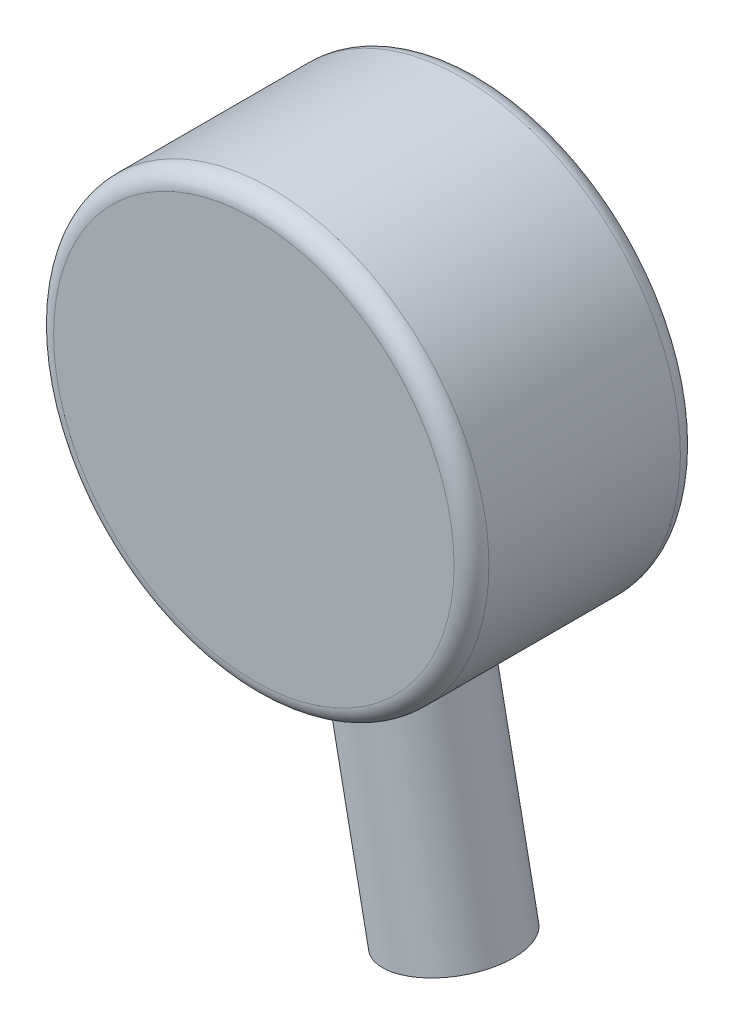
ISO-10303-21;
HEADER;
FILE_DESCRIPTION(('STEP AP214'),'2;1');
FILE_NAME('part.step','',(''),(''),'','','');
FILE_SCHEMA(('AUTOMOTIVE_DESIGN { 1 0 10303 214 1 1 1 1 }'));
ENDSEC;
DATA;
#1=APPLICATION_CONTEXT('core data for automotive mechanical design processes');
#2=APPLICATION_PROTOCOL_DEFINITION('international standard','automotive_design',2000,#1);
#3=PRODUCT_CONTEXT('',#1,'mechanical');
#4=PRODUCT('Part','Part','',(#3));
#5=PRODUCT_RELATED_PRODUCT_CATEGORY('part','',(#4));
#6=PRODUCT_DEFINITION_FORMATION('','',#4);
#7=PRODUCT_DEFINITION_CONTEXT('part definition',#1,'design');
#8=PRODUCT_DEFINITION('design','',#6,#7);
#9=PRODUCT_DEFINITION_SHAPE('','',#8);
#10=(LENGTH_UNIT() NAMED_UNIT(*) SI_UNIT(.MILLI.,.METRE.));
#11=(NAMED_UNIT(*) PLANE_ANGLE_UNIT() SI_UNIT($,.RADIAN.));
#12=(NAMED_UNIT(*) SI_UNIT($,.STERADIAN.) SOLID_ANGLE_UNIT());
#13=UNCERTAINTY_MEASURE_WITH_UNIT(LENGTH_MEASURE(1.E-05),#10,'distance_accuracy_value','');
#14=(GEOMETRIC_REPRESENTATION_CONTEXT(3) GLOBAL_UNCERTAINTY_ASSIGNED_CONTEXT((#13)) GLOBAL_UNIT_ASSIGNED_CONTEXT((#10,
#11,#12)) REPRESENTATION_CONTEXT('',''));
#15=CARTESIAN_POINT('',(0.,0.,0.));
#16=DIRECTION('',(0.,0.,1.));
#17=DIRECTION('',(1.,0.,0.));
#18=AXIS2_PLACEMENT_3D('',#15,#16,#17);
#19=CARTESIAN_POINT('',(2.44105476008268,-12.259333246889,0.));
#20=DIRECTION('',(0.195284380806614,-0.980746659751119,0.));
#21=DIRECTION('',(0.980746659751119,0.195284380806614,0.));
#22=AXIS2_PLACEMENT_3D('',#19,#20,#21);
#23=PLANE('',#22);
#24=CARTESIAN_POINT('',(2.44105475814458,-12.2593332472749,6.5));
#25=DIRECTION('',(0.195284380651567,-0.980746659781992,0.));
#26=DIRECTION('',(0.980746659781992,0.195284380651567,0.));
#27=AXIS2_PLACEMENT_3D('',#24,#25,#26);
#28=CIRCLE('',#27,3.5);
#29=CARTESIAN_POINT('',(5.87366806738155,-11.5758379149944,6.5));
#30=VERTEX_POINT('',#29);
#31=EDGE_CURVE('E46',#30,#30,#28,.T.);
#32=ORIENTED_EDGE('',*,*,#31,.F.);
#33=EDGE_LOOP('',(#32));
#34=FACE_BOUND('',#33,.T.);
#35=ADVANCED_FACE('F40',(#34),#23,.F.);
#36=CARTESIAN_POINT('',(4.97975170855304,-25.0090398240549,0.));
#37=DIRECTION('',(0.195284380806614,-0.980746659751119,0.));
#38=DIRECTION('',(0.980746659751119,0.195284380806614,0.));
#39=AXIS2_PLACEMENT_3D('',#36,#37,#38);
#40=PLANE('',#39);
#41=CARTESIAN_POINT('',(4.97975170661495,-25.0090398244408,6.5));
#42=DIRECTION('',(0.195284380651567,-0.980746659781992,0.));
#43=DIRECTION('',(0.980746659781992,0.195284380651567,0.));
#44=AXIS2_PLACEMENT_3D('',#41,#42,#43);
#45=CIRCLE('',#44,3.5);
#46=CARTESIAN_POINT('',(8.41236501585192,-24.3255444921603,6.5));
#47=VERTEX_POINT('',#46);
#48=EDGE_CURVE('E12',#47,#47,#45,.T.);
#49=ORIENTED_EDGE('',*,*,#48,.T.);
#50=EDGE_LOOP('',(#49));
#51=FACE_BOUND('',#50,.T.);
#52=ADVANCED_FACE('F56',(#51),#40,.T.);
#53=CARTESIAN_POINT('',(2.44105475814458,-12.2593332472749,6.5));
#54=DIRECTION('',(0.195284380651567,-0.980746659781992,0.));
#55=DIRECTION('',(0.980746659781992,0.195284380651567,0.));
#56=AXIS2_PLACEMENT_3D('',#53,#54,#55);
#57=CYLINDRICAL_SURFACE('',#56,3.5);
#58=ORIENTED_EDGE('',*,*,#31,.T.);
#59=EDGE_LOOP('',(#58));
#60=FACE_BOUND('',#59,.T.);
#61=ORIENTED_EDGE('',*,*,#48,.F.);
#62=EDGE_LOOP('',(#61));
#63=FACE_BOUND('',#62,.T.);
#64=ADVANCED_FACE('F52',(#60,#63),#57,.T.);
#65=CLOSED_SHELL('',(#35,#52,#64));
#66=MANIFOLD_SOLID_BREP('B2',#65);
#67=CARTESIAN_POINT('',(0.,0.,13.));
#68=DIRECTION('',(0.,0.,-1.));
#69=DIRECTION('',(-1.,0.,0.));
#70=AXIS2_PLACEMENT_3D('',#67,#68,#69);
#71=CYLINDRICAL_SURFACE('',#70,12.5);
#72=CARTESIAN_POINT('',(0.,0.,12.));
#73=DIRECTION('',(0.,0.,1.));
#74=DIRECTION('',(1.,0.,0.));
#75=AXIS2_PLACEMENT_3D('',#72,#73,#74);
#76=CIRCLE('',#75,12.5);
#77=CARTESIAN_POINT('',(-12.5,0.,12.));
#78=VERTEX_POINT('',#77);
#79=EDGE_CURVE('E88',#78,#78,#76,.F.);
#80=CARTESIAN_POINT('',(0.,0.,0.999999999999999));
#81=DIRECTION('',(0.,0.,1.));
#82=DIRECTION('',(1.,0.,0.));
#83=AXIS2_PLACEMENT_3D('',#80,#81,#82);
#84=CIRCLE('',#83,12.5);
#85=CARTESIAN_POINT('',(-12.5,0.,0.999999999999997));
#86=VERTEX_POINT('',#85);
#87=EDGE_CURVE('E92',#86,#86,#84,.T.);
#88=CARTESIAN_POINT('',(-12.5,0.,12.));
#89=CARTESIAN_POINT('',(-12.5,0.,11.8854166666667));
#90=CARTESIAN_POINT('',(-12.5,0.,11.7708333333333));
#91=CARTESIAN_POINT('',(-12.5,0.,11.5416666666667));
#92=CARTESIAN_POINT('',(-12.5,0.,11.4270833333333));
#93=CARTESIAN_POINT('',(-12.5,0.,11.1979166666667));
#94=CARTESIAN_POINT('',(-12.5,0.,11.0833333333333));
#95=CARTESIAN_POINT('',(-12.5,0.,10.8541666666667));
#96=CARTESIAN_POINT('',(-12.5,0.,10.7395833333333));
#97=CARTESIAN_POINT('',(-12.5,0.,10.5104166666667));
#98=CARTESIAN_POINT('',(-12.5,0.,10.3958333333333));
#99=CARTESIAN_POINT('',(-12.5,0.,10.1666666666667));
#100=CARTESIAN_POINT('',(-12.5,0.,10.0520833333333));
#101=CARTESIAN_POINT('',(-12.5,0.,9.82291666666667));
#102=CARTESIAN_POINT('',(-12.5,0.,9.70833333333333));
#103=CARTESIAN_POINT('',(-12.5,0.,9.47916666666667));
#104=CARTESIAN_POINT('',(-12.5,0.,9.36458333333333));
#105=CARTESIAN_POINT('',(-12.5,0.,9.13541666666666));
#106=CARTESIAN_POINT('',(-12.5,0.,9.02083333333333));
#107=CARTESIAN_POINT('',(-12.5,0.,8.79166666666666));
#108=CARTESIAN_POINT('',(-12.5,0.,8.67708333333333));
#109=CARTESIAN_POINT('',(-12.5,0.,8.44791666666667));
#110=CARTESIAN_POINT('',(-12.5,0.,8.33333333333333));
#111=CARTESIAN_POINT('',(-12.5,0.,8.10416666666667));
#112=CARTESIAN_POINT('',(-12.5,0.,7.98958333333333));
#113=CARTESIAN_POINT('',(-12.5,0.,7.76041666666667));
#114=CARTESIAN_POINT('',(-12.5,0.,7.64583333333333));
#115=CARTESIAN_POINT('',(-12.5,0.,7.41666666666667));
#116=CARTESIAN_POINT('',(-12.5,0.,7.30208333333333));
#117=CARTESIAN_POINT('',(-12.5,0.,7.07291666666667));
#118=CARTESIAN_POINT('',(-12.5,0.,6.95833333333333));
#119=CARTESIAN_POINT('',(-12.5,0.,6.72916666666666));
#120=CARTESIAN_POINT('',(-12.5,0.,6.61458333333333));
#121=CARTESIAN_POINT('',(-12.5,0.,6.38541666666666));
#122=CARTESIAN_POINT('',(-12.5,0.,6.27083333333333));
#123=CARTESIAN_POINT('',(-12.5,0.,6.04166666666666));
#124=CARTESIAN_POINT('',(-12.5,0.,5.92708333333333));
#125=CARTESIAN_POINT('',(-12.5,0.,5.69791666666666));
#126=CARTESIAN_POINT('',(-12.5,0.,5.58333333333333));
#127=CARTESIAN_POINT('',(-12.5,0.,5.35416666666667));
#128=CARTESIAN_POINT('',(-12.5,0.,5.23958333333333));
#129=CARTESIAN_POINT('',(-12.5,0.,5.01041666666667));
#130=CARTESIAN_POINT('',(-12.5,0.,4.89583333333333));
#131=CARTESIAN_POINT('',(-12.5,0.,4.66666666666667));
#132=CARTESIAN_POINT('',(-12.5,0.,4.55208333333333));
#133=CARTESIAN_POINT('',(-12.5,0.,4.32291666666667));
#134=CARTESIAN_POINT('',(-12.5,0.,4.20833333333333));
#135=CARTESIAN_POINT('',(-12.5,0.,3.97916666666666));
#136=CARTESIAN_POINT('',(-12.5,0.,3.86458333333333));
#137=CARTESIAN_POINT('',(-12.5,0.,3.63541666666666));
#138=CARTESIAN_POINT('',(-12.5,0.,3.52083333333333));
#139=CARTESIAN_POINT('',(-12.5,0.,3.29166666666666));
#140=CARTESIAN_POINT('',(-12.5,0.,3.17708333333333));
#141=CARTESIAN_POINT('',(-12.5,0.,2.94791666666666));
#142=CARTESIAN_POINT('',(-12.5,0.,2.83333333333333));
#143=CARTESIAN_POINT('',(-12.5,0.,2.60416666666666));
#144=CARTESIAN_POINT('',(-12.5,0.,2.48958333333333));
#145=CARTESIAN_POINT('',(-12.5,0.,2.26041666666667));
#146=CARTESIAN_POINT('',(-12.5,0.,2.14583333333333));
#147=CARTESIAN_POINT('',(-12.5,0.,1.91666666666666));
#148=CARTESIAN_POINT('',(-12.5,0.,1.80208333333333));
#149=CARTESIAN_POINT('',(-12.5,0.,1.57291666666666));
#150=CARTESIAN_POINT('',(-12.5,0.,1.45833333333333));
#151=CARTESIAN_POINT('',(-12.5,0.,1.22916666666666));
#152=CARTESIAN_POINT('',(-12.5,0.,1.11458333333333));
#153=CARTESIAN_POINT('',(-12.5,0.,0.999999999999997));
#154=B_SPLINE_CURVE_WITH_KNOTS('',3,(#88,#89,#90,#91,#92,#93,#94,#95,#96,#97,#98,#99,#100,#101,
#102,#103,#104,#105,#106,#107,#108,#109,#110,#111,#112,#113,#114,#115,#116,#117,#118,#119,#120,
#121,#122,#123,#124,#125,#126,#127,#128,#129,#130,#131,#132,#133,#134,#135,#136,#137,#138,#139,
#140,#141,#142,#143,#144,#145,#146,#147,#148,#149,#150,#151,#152,#153),.UNSPECIFIED.,.F.,.F.,(4,
2,2,2,2,2,2,2,2,2,2,2,2,2,2,2,2,2,2,2,2,2,2,2,2,2,2,2,2,2,2,2,4),(0.,0.343749999999999,
0.687499999999999,1.03125,1.375,1.71875,2.0625,2.40625,2.75,3.09375,3.4375,3.78125,4.125,
4.46875,4.8125,5.15625,5.5,5.84375,6.1875,6.53125,6.875,7.21875,7.5625,7.90625,8.25,8.59375,
8.9375,9.28125,9.625,9.96875,10.3125,10.65625,11.),.UNSPECIFIED.);
#155=EDGE_CURVE('BSEAM81',#78,#86,#154,.T.);
#156=ORIENTED_EDGE('',*,*,#79,.T.);
#157=ORIENTED_EDGE('',*,*,#87,.T.);
#158=ORIENTED_EDGE('',*,*,#155,.T.);
#159=ORIENTED_EDGE('',*,*,#155,.F.);
#160=EDGE_LOOP('',(#156,#158,#157,#159));
#161=FACE_BOUND('',#160,.T.);
#162=ADVANCED_FACE('F81',(#161),#71,.T.);
#163=CARTESIAN_POINT('',(0.,0.,13.));
#164=DIRECTION('',(0.,0.,1.));
#165=DIRECTION('',(1.,0.,0.));
#166=AXIS2_PLACEMENT_3D('',#163,#164,#165);
#167=PLANE('',#166);
#168=CARTESIAN_POINT('',(0.,0.,13.));
#169=DIRECTION('',(0.,0.,1.));
#170=DIRECTION('',(1.,0.,0.));
#171=AXIS2_PLACEMENT_3D('',#168,#169,#170);
#172=CIRCLE('',#171,11.5);
#173=CARTESIAN_POINT('',(11.5,0.,13.));
#174=VERTEX_POINT('',#173);
#175=EDGE_CURVE('E96',#174,#174,#172,.T.);
#176=ORIENTED_EDGE('',*,*,#175,.T.);
#177=EDGE_LOOP('',(#176));
#178=FACE_BOUND('',#177,.T.);
#179=ADVANCED_FACE('F102',(#178),#167,.T.);
#180=CARTESIAN_POINT('',(0.,0.,0.));
#181=DIRECTION('',(0.,0.,1.));
#182=DIRECTION('',(1.,0.,0.));
#183=AXIS2_PLACEMENT_3D('',#180,#181,#182);
#184=PLANE('',#183);
#185=CARTESIAN_POINT('',(0.,0.,0.));
#186=DIRECTION('',(0.,0.,1.));
#187=DIRECTION('',(1.,0.,0.));
#188=AXIS2_PLACEMENT_3D('',#185,#186,#187);
#189=CIRCLE('',#188,11.5);
#190=CARTESIAN_POINT('',(11.5,0.,0.));
#191=VERTEX_POINT('',#190);
#192=EDGE_CURVE('E39',#191,#191,#189,.F.);
#193=ORIENTED_EDGE('',*,*,#192,.T.);
#194=EDGE_LOOP('',(#193));
#195=FACE_BOUND('',#194,.T.);
#196=ADVANCED_FACE('F106',(#195),#184,.F.);
#197=CARTESIAN_POINT('',(0.,0.,12.));
#198=DIRECTION('',(0.,0.,1.));
#199=DIRECTION('',(1.,0.,0.));
#200=AXIS2_PLACEMENT_3D('',#197,#198,#199);
#201=TOROIDAL_SURFACE('',#200,11.5,1.);
#202=ORIENTED_EDGE('',*,*,#79,.F.);
#203=EDGE_LOOP('',(#202));
#204=FACE_BOUND('',#203,.T.);
#205=ORIENTED_EDGE('',*,*,#175,.F.);
#206=EDGE_LOOP('',(#205));
#207=FACE_BOUND('',#206,.T.);
#208=ADVANCED_FACE('F104',(#204,#207),#201,.T.);
#209=CARTESIAN_POINT('',(0.,0.,0.999999999999999));
#210=DIRECTION('',(0.,0.,1.));
#211=DIRECTION('',(1.,0.,0.));
#212=AXIS2_PLACEMENT_3D('',#209,#210,#211);
#213=TOROIDAL_SURFACE('',#212,11.5,1.);
#214=ORIENTED_EDGE('',*,*,#192,.F.);
#215=EDGE_LOOP('',(#214));
#216=FACE_BOUND('',#215,.T.);
#217=ORIENTED_EDGE('',*,*,#87,.F.);
#218=EDGE_LOOP('',(#217));
#219=FACE_BOUND('',#218,.T.);
#220=ADVANCED_FACE('F83',(#216,#219),#213,.T.);
#221=CLOSED_SHELL('',(#162,#179,#196,#208,#220));
#222=MANIFOLD_SOLID_BREP('B7',#221);
#223=ADVANCED_BREP_SHAPE_REPRESENTATION('',(#18,#66,#222),#14);
#224=SHAPE_DEFINITION_REPRESENTATION(#9,#223);
ENDSEC;
END-ISO-10303-21;
